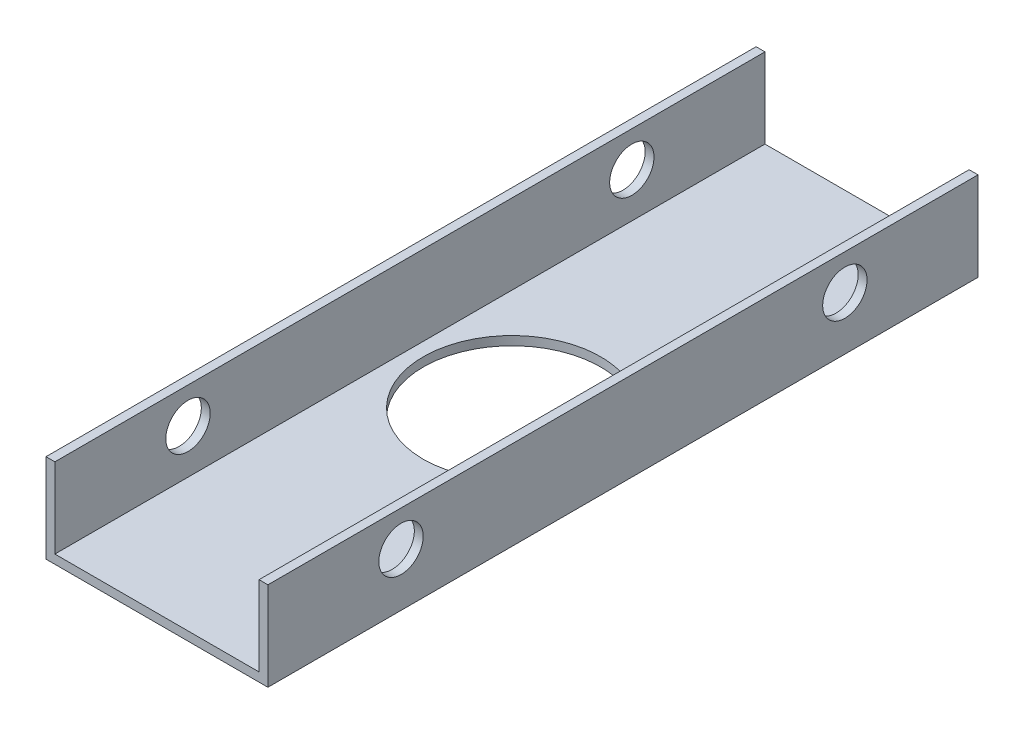
ISO-10303-21;
HEADER;
FILE_DESCRIPTION(('STEP AP214'),'2;1');
FILE_NAME('part.step','',(''),(''),'','','');
FILE_SCHEMA(('AUTOMOTIVE_DESIGN { 1 0 10303 214 1 1 1 1 }'));
ENDSEC;
DATA;
#1=APPLICATION_CONTEXT('core data for automotive mechanical design processes');
#2=APPLICATION_PROTOCOL_DEFINITION('international standard','automotive_design',2000,#1);
#3=PRODUCT_CONTEXT('',#1,'mechanical');
#4=PRODUCT('Part','Part','',(#3));
#5=PRODUCT_RELATED_PRODUCT_CATEGORY('part','',(#4));
#6=PRODUCT_DEFINITION_FORMATION('','',#4);
#7=PRODUCT_DEFINITION_CONTEXT('part definition',#1,'design');
#8=PRODUCT_DEFINITION('design','',#6,#7);
#9=PRODUCT_DEFINITION_SHAPE('','',#8);
#10=(LENGTH_UNIT() NAMED_UNIT(*) SI_UNIT(.MILLI.,.METRE.));
#11=(NAMED_UNIT(*) PLANE_ANGLE_UNIT() SI_UNIT($,.RADIAN.));
#12=(NAMED_UNIT(*) SI_UNIT($,.STERADIAN.) SOLID_ANGLE_UNIT());
#13=UNCERTAINTY_MEASURE_WITH_UNIT(LENGTH_MEASURE(1.E-05),#10,'distance_accuracy_value','');
#14=(GEOMETRIC_REPRESENTATION_CONTEXT(3) GLOBAL_UNCERTAINTY_ASSIGNED_CONTEXT((#13)) GLOBAL_UNIT_ASSIGNED_CONTEXT((#10,
#11,#12)) REPRESENTATION_CONTEXT('',''));
#15=CARTESIAN_POINT('',(0.,0.,0.));
#16=DIRECTION('',(0.,0.,1.));
#17=DIRECTION('',(1.,0.,0.));
#18=AXIS2_PLACEMENT_3D('',#15,#16,#17);
#19=CARTESIAN_POINT('',(0.,1.,0.));
#20=DIRECTION('',(0.,-1.,0.));
#21=DIRECTION('',(0.,0.,-1.));
#22=AXIS2_PLACEMENT_3D('',#19,#20,#21);
#23=PLANE('',#22);
#24=DIRECTION('',(0.,0.,-1.));
#25=VECTOR('',#24,1.);
#26=CARTESIAN_POINT('',(11.5,1.,40.));
#27=LINE('',#26,#25);
#28=CARTESIAN_POINT('',(11.5,0.999999999999999,40.));
#29=VERTEX_POINT('',#28);
#30=CARTESIAN_POINT('',(11.5,1.,-40.));
#31=VERTEX_POINT('',#30);
#32=EDGE_CURVE('E182',#29,#31,#27,.T.);
#33=ORIENTED_EDGE('',*,*,#32,.T.);
#34=DIRECTION('',(-1.,0.,0.));
#35=VECTOR('',#34,1.);
#36=CARTESIAN_POINT('',(-11.5,1.,-40.));
#37=LINE('',#36,#35);
#38=CARTESIAN_POINT('',(-11.5,1.,-40.));
#39=VERTEX_POINT('',#38);
#40=EDGE_CURVE('E185',#31,#39,#37,.T.);
#41=ORIENTED_EDGE('',*,*,#40,.T.);
#42=DIRECTION('',(0.,0.,1.));
#43=VECTOR('',#42,1.);
#44=CARTESIAN_POINT('',(-11.5,1.,40.));
#45=LINE('',#44,#43);
#46=CARTESIAN_POINT('',(-11.5,1.,40.));
#47=VERTEX_POINT('',#46);
#48=EDGE_CURVE('E48',#39,#47,#45,.T.);
#49=ORIENTED_EDGE('',*,*,#48,.T.);
#50=DIRECTION('',(1.,0.,0.));
#51=VECTOR('',#50,1.);
#52=CARTESIAN_POINT('',(-11.5,1.,40.));
#53=LINE('',#52,#51);
#54=EDGE_CURVE('E11',#47,#29,#53,.T.);
#55=ORIENTED_EDGE('',*,*,#54,.T.);
#56=EDGE_LOOP('',(#33,#41,#49,#55));
#57=FACE_BOUND('',#56,.T.);
#58=CARTESIAN_POINT('',(0.,1.,0.));
#59=DIRECTION('',(0.,1.,0.));
#60=DIRECTION('',(0.,0.,1.));
#61=AXIS2_PLACEMENT_3D('',#58,#59,#60);
#62=CIRCLE('',#61,10.);
#63=CARTESIAN_POINT('',(0.,1.,10.));
#64=VERTEX_POINT('',#63);
#65=EDGE_CURVE('E119',#64,#64,#62,.T.);
#66=ORIENTED_EDGE('',*,*,#65,.F.);
#67=EDGE_LOOP('',(#66));
#68=FACE_BOUND('',#67,.T.);
#69=ADVANCED_FACE('F39',(#57,#68),#23,.F.);
#70=CARTESIAN_POINT('',(0.,0.,0.));
#71=DIRECTION('',(0.,-1.,0.));
#72=DIRECTION('',(0.,0.,-1.));
#73=AXIS2_PLACEMENT_3D('',#70,#71,#72);
#74=PLANE('',#73);
#75=DIRECTION('',(-1.,0.,0.));
#76=VECTOR('',#75,1.);
#77=CARTESIAN_POINT('',(-11.5,0.,-40.));
#78=LINE('',#77,#76);
#79=CARTESIAN_POINT('',(12.5,0.,-40.));
#80=VERTEX_POINT('',#79);
#81=CARTESIAN_POINT('',(-12.5,0.,-40.));
#82=VERTEX_POINT('',#81);
#83=EDGE_CURVE('E107',#80,#82,#78,.T.);
#84=ORIENTED_EDGE('',*,*,#83,.F.);
#85=DIRECTION('',(0.,0.,1.));
#86=VECTOR('',#85,1.);
#87=CARTESIAN_POINT('',(12.5,0.,40.));
#88=LINE('',#87,#86);
#89=CARTESIAN_POINT('',(12.5,0.,40.));
#90=VERTEX_POINT('',#89);
#91=EDGE_CURVE('E111',#80,#90,#88,.T.);
#92=ORIENTED_EDGE('',*,*,#91,.T.);
#93=DIRECTION('',(1.,0.,0.));
#94=VECTOR('',#93,1.);
#95=CARTESIAN_POINT('',(-11.5,0.,40.));
#96=LINE('',#95,#94);
#97=CARTESIAN_POINT('',(-12.5,0.,40.));
#98=VERTEX_POINT('',#97);
#99=EDGE_CURVE('E43',#98,#90,#96,.T.);
#100=ORIENTED_EDGE('',*,*,#99,.F.);
#101=DIRECTION('',(0.,0.,1.));
#102=VECTOR('',#101,1.);
#103=CARTESIAN_POINT('',(-12.5,0.,40.));
#104=LINE('',#103,#102);
#105=EDGE_CURVE('E114',#82,#98,#104,.T.);
#106=ORIENTED_EDGE('',*,*,#105,.F.);
#107=EDGE_LOOP('',(#84,#92,#100,#106));
#108=FACE_BOUND('',#107,.T.);
#109=CARTESIAN_POINT('',(0.,0.,0.));
#110=DIRECTION('',(0.,1.,0.));
#111=DIRECTION('',(0.,0.,1.));
#112=AXIS2_PLACEMENT_3D('',#109,#110,#111);
#113=CIRCLE('',#112,10.);
#114=CARTESIAN_POINT('',(0.,0.,10.));
#115=VERTEX_POINT('',#114);
#116=EDGE_CURVE('E177',#115,#115,#113,.T.);
#117=ORIENTED_EDGE('',*,*,#116,.T.);
#118=EDGE_LOOP('',(#117));
#119=FACE_BOUND('',#118,.T.);
#120=ADVANCED_FACE('F109',(#108,#119),#74,.T.);
#121=CARTESIAN_POINT('',(-11.5,1.,-40.));
#122=DIRECTION('',(0.,0.,1.));
#123=DIRECTION('',(1.,0.,0.));
#124=AXIS2_PLACEMENT_3D('',#121,#122,#123);
#125=PLANE('',#124);
#126=ORIENTED_EDGE('',*,*,#83,.T.);
#127=DIRECTION('',(0.,-1.,0.));
#128=VECTOR('',#127,1.);
#129=CARTESIAN_POINT('',(-12.5,0.,-40.));
#130=LINE('',#129,#128);
#131=CARTESIAN_POINT('',(-12.5,10.,-40.));
#132=VERTEX_POINT('',#131);
#133=EDGE_CURVE('E164',#132,#82,#130,.T.);
#134=ORIENTED_EDGE('',*,*,#133,.F.);
#135=DIRECTION('',(1.,0.,0.));
#136=VECTOR('',#135,1.);
#137=CARTESIAN_POINT('',(-12.5,10.,-40.));
#138=LINE('',#137,#136);
#139=CARTESIAN_POINT('',(-11.5,10.,-40.));
#140=VERTEX_POINT('',#139);
#141=EDGE_CURVE('E166',#132,#140,#138,.T.);
#142=ORIENTED_EDGE('',*,*,#141,.T.);
#143=DIRECTION('',(0.,-1.,0.));
#144=VECTOR('',#143,1.);
#145=CARTESIAN_POINT('',(-11.5,0.,-40.));
#146=LINE('',#145,#144);
#147=EDGE_CURVE('E160',#140,#39,#146,.T.);
#148=ORIENTED_EDGE('',*,*,#147,.T.);
#149=ORIENTED_EDGE('',*,*,#40,.F.);
#150=DIRECTION('',(0.,-1.,0.));
#151=VECTOR('',#150,1.);
#152=CARTESIAN_POINT('',(11.5,0.,-40.));
#153=LINE('',#152,#151);
#154=CARTESIAN_POINT('',(11.5,10.,-40.));
#155=VERTEX_POINT('',#154);
#156=EDGE_CURVE('E64',#155,#31,#153,.T.);
#157=ORIENTED_EDGE('',*,*,#156,.F.);
#158=DIRECTION('',(-1.,0.,0.));
#159=VECTOR('',#158,1.);
#160=CARTESIAN_POINT('',(12.5,10.,-40.));
#161=LINE('',#160,#159);
#162=CARTESIAN_POINT('',(12.5,10.,-40.));
#163=VERTEX_POINT('',#162);
#164=EDGE_CURVE('E130',#163,#155,#161,.T.);
#165=ORIENTED_EDGE('',*,*,#164,.F.);
#166=DIRECTION('',(0.,-1.,0.));
#167=VECTOR('',#166,1.);
#168=CARTESIAN_POINT('',(12.5,0.,-40.));
#169=LINE('',#168,#167);
#170=EDGE_CURVE('E124',#163,#80,#169,.T.);
#171=ORIENTED_EDGE('',*,*,#170,.T.);
#172=EDGE_LOOP('',(#126,#134,#142,#148,#149,#157,#165,#171));
#173=FACE_BOUND('',#172,.T.);
#174=ADVANCED_FACE('F41',(#173),#125,.F.);
#175=CARTESIAN_POINT('',(-11.5,1.,40.));
#176=DIRECTION('',(0.,0.,-1.));
#177=DIRECTION('',(-1.,0.,0.));
#178=AXIS2_PLACEMENT_3D('',#175,#176,#177);
#179=PLANE('',#178);
#180=ORIENTED_EDGE('',*,*,#99,.T.);
#181=DIRECTION('',(0.,1.,0.));
#182=VECTOR('',#181,1.);
#183=CARTESIAN_POINT('',(12.5,10.,40.));
#184=LINE('',#183,#182);
#185=CARTESIAN_POINT('',(12.5,10.,40.));
#186=VERTEX_POINT('',#185);
#187=EDGE_CURVE('E127',#90,#186,#184,.T.);
#188=ORIENTED_EDGE('',*,*,#187,.T.);
#189=DIRECTION('',(-1.,0.,0.));
#190=VECTOR('',#189,1.);
#191=CARTESIAN_POINT('',(12.5,10.,40.));
#192=LINE('',#191,#190);
#193=CARTESIAN_POINT('',(11.5,10.,40.));
#194=VERTEX_POINT('',#193);
#195=EDGE_CURVE('E137',#186,#194,#192,.T.);
#196=ORIENTED_EDGE('',*,*,#195,.T.);
#197=DIRECTION('',(0.,1.,0.));
#198=VECTOR('',#197,1.);
#199=CARTESIAN_POINT('',(11.5,10.,40.));
#200=LINE('',#199,#198);
#201=EDGE_CURVE('E128',#29,#194,#200,.T.);
#202=ORIENTED_EDGE('',*,*,#201,.F.);
#203=ORIENTED_EDGE('',*,*,#54,.F.);
#204=DIRECTION('',(0.,1.,0.));
#205=VECTOR('',#204,1.);
#206=CARTESIAN_POINT('',(-11.5,10.,40.));
#207=LINE('',#206,#205);
#208=CARTESIAN_POINT('',(-11.5,10.,40.));
#209=VERTEX_POINT('',#208);
#210=EDGE_CURVE('E56',#47,#209,#207,.T.);
#211=ORIENTED_EDGE('',*,*,#210,.T.);
#212=DIRECTION('',(1.,0.,0.));
#213=VECTOR('',#212,1.);
#214=CARTESIAN_POINT('',(-12.5,10.,40.));
#215=LINE('',#214,#213);
#216=CARTESIAN_POINT('',(-12.5,10.,40.));
#217=VERTEX_POINT('',#216);
#218=EDGE_CURVE('E174',#217,#209,#215,.T.);
#219=ORIENTED_EDGE('',*,*,#218,.F.);
#220=DIRECTION('',(0.,1.,0.));
#221=VECTOR('',#220,1.);
#222=CARTESIAN_POINT('',(-12.5,10.,40.));
#223=LINE('',#222,#221);
#224=EDGE_CURVE('E159',#98,#217,#223,.T.);
#225=ORIENTED_EDGE('',*,*,#224,.F.);
#226=EDGE_LOOP('',(#180,#188,#196,#202,#203,#211,#219,#225));
#227=FACE_BOUND('',#226,.T.);
#228=ADVANCED_FACE('F194',(#227),#179,.F.);
#229=CARTESIAN_POINT('',(0.,1.,0.));
#230=DIRECTION('',(0.,-1.,0.));
#231=DIRECTION('',(0.,0.,-1.));
#232=AXIS2_PLACEMENT_3D('',#229,#230,#231);
#233=CYLINDRICAL_SURFACE('',#232,10.);
#234=ORIENTED_EDGE('',*,*,#65,.T.);
#235=EDGE_LOOP('',(#234));
#236=FACE_BOUND('',#235,.T.);
#237=ORIENTED_EDGE('',*,*,#116,.F.);
#238=EDGE_LOOP('',(#237));
#239=FACE_BOUND('',#238,.T.);
#240=ADVANCED_FACE('F224',(#236,#239),#233,.F.);
#241=CARTESIAN_POINT('',(-11.5,0.,0.));
#242=DIRECTION('',(1.,0.,0.));
#243=DIRECTION('',(0.,0.,-1.));
#244=AXIS2_PLACEMENT_3D('',#241,#242,#243);
#245=PLANE('',#244);
#246=CARTESIAN_POINT('',(-11.5,6.,25.));
#247=DIRECTION('',(-1.,0.,0.));
#248=DIRECTION('',(0.,0.,-1.));
#249=AXIS2_PLACEMENT_3D('',#246,#247,#248);
#250=CIRCLE('',#249,2.5);
#251=CARTESIAN_POINT('',(-11.5,6.,22.5));
#252=VERTEX_POINT('',#251);
#253=EDGE_CURVE('E146',#252,#252,#250,.T.);
#254=ORIENTED_EDGE('',*,*,#253,.T.);
#255=EDGE_LOOP('',(#254));
#256=FACE_BOUND('',#255,.T.);
#257=CARTESIAN_POINT('',(-11.5,6.,-25.));
#258=DIRECTION('',(-1.,0.,0.));
#259=DIRECTION('',(0.,0.,1.));
#260=AXIS2_PLACEMENT_3D('',#257,#258,#259);
#261=CIRCLE('',#260,2.5);
#262=CARTESIAN_POINT('',(-11.5,6.,-22.5));
#263=VERTEX_POINT('',#262);
#264=EDGE_CURVE('E150',#263,#263,#261,.T.);
#265=ORIENTED_EDGE('',*,*,#264,.T.);
#266=EDGE_LOOP('',(#265));
#267=FACE_BOUND('',#266,.T.);
#268=ORIENTED_EDGE('',*,*,#48,.F.);
#269=ORIENTED_EDGE('',*,*,#147,.F.);
#270=DIRECTION('',(0.,0.,-1.));
#271=VECTOR('',#270,1.);
#272=CARTESIAN_POINT('',(-11.5,10.,-40.));
#273=LINE('',#272,#271);
#274=EDGE_CURVE('E168',#209,#140,#273,.T.);
#275=ORIENTED_EDGE('',*,*,#274,.F.);
#276=ORIENTED_EDGE('',*,*,#210,.F.);
#277=EDGE_LOOP('',(#268,#269,#275,#276));
#278=FACE_BOUND('',#277,.T.);
#279=ADVANCED_FACE('F201',(#256,#267,#278),#245,.T.);
#280=CARTESIAN_POINT('',(-12.5,0.,0.));
#281=DIRECTION('',(1.,0.,0.));
#282=DIRECTION('',(0.,0.,-1.));
#283=AXIS2_PLACEMENT_3D('',#280,#281,#282);
#284=PLANE('',#283);
#285=ORIENTED_EDGE('',*,*,#105,.T.);
#286=ORIENTED_EDGE('',*,*,#224,.T.);
#287=DIRECTION('',(0.,0.,-1.));
#288=VECTOR('',#287,1.);
#289=CARTESIAN_POINT('',(-12.5,10.,-40.));
#290=LINE('',#289,#288);
#291=EDGE_CURVE('E162',#217,#132,#290,.T.);
#292=ORIENTED_EDGE('',*,*,#291,.T.);
#293=ORIENTED_EDGE('',*,*,#133,.T.);
#294=EDGE_LOOP('',(#285,#286,#292,#293));
#295=FACE_BOUND('',#294,.T.);
#296=CARTESIAN_POINT('',(-12.5,6.,-25.));
#297=DIRECTION('',(-1.,0.,0.));
#298=DIRECTION('',(0.,0.,1.));
#299=AXIS2_PLACEMENT_3D('',#296,#297,#298);
#300=CIRCLE('',#299,2.5);
#301=CARTESIAN_POINT('',(-12.5,6.,-22.5));
#302=VERTEX_POINT('',#301);
#303=EDGE_CURVE('E153',#302,#302,#300,.T.);
#304=ORIENTED_EDGE('',*,*,#303,.F.);
#305=EDGE_LOOP('',(#304));
#306=FACE_BOUND('',#305,.T.);
#307=CARTESIAN_POINT('',(-12.5,6.,25.));
#308=DIRECTION('',(-1.,0.,0.));
#309=DIRECTION('',(0.,0.,-1.));
#310=AXIS2_PLACEMENT_3D('',#307,#308,#309);
#311=CIRCLE('',#310,2.5);
#312=CARTESIAN_POINT('',(-12.5,6.,22.5));
#313=VERTEX_POINT('',#312);
#314=EDGE_CURVE('E147',#313,#313,#311,.T.);
#315=ORIENTED_EDGE('',*,*,#314,.F.);
#316=EDGE_LOOP('',(#315));
#317=FACE_BOUND('',#316,.T.);
#318=ADVANCED_FACE('F207',(#295,#306,#317),#284,.F.);
#319=CARTESIAN_POINT('',(-12.5,10.,-40.));
#320=DIRECTION('',(0.,-1.,0.));
#321=DIRECTION('',(0.,0.,-1.));
#322=AXIS2_PLACEMENT_3D('',#319,#320,#321);
#323=PLANE('',#322);
#324=ORIENTED_EDGE('',*,*,#274,.T.);
#325=ORIENTED_EDGE('',*,*,#141,.F.);
#326=ORIENTED_EDGE('',*,*,#291,.F.);
#327=ORIENTED_EDGE('',*,*,#218,.T.);
#328=EDGE_LOOP('',(#324,#325,#326,#327));
#329=FACE_BOUND('',#328,.T.);
#330=ADVANCED_FACE('F203',(#329),#323,.F.);
#331=CARTESIAN_POINT('',(-12.5,6.,-25.));
#332=DIRECTION('',(1.,0.,0.));
#333=DIRECTION('',(0.,0.,-1.));
#334=AXIS2_PLACEMENT_3D('',#331,#332,#333);
#335=CYLINDRICAL_SURFACE('',#334,2.5);
#336=ORIENTED_EDGE('',*,*,#303,.T.);
#337=EDGE_LOOP('',(#336));
#338=FACE_BOUND('',#337,.T.);
#339=ORIENTED_EDGE('',*,*,#264,.F.);
#340=EDGE_LOOP('',(#339));
#341=FACE_BOUND('',#340,.T.);
#342=ADVANCED_FACE('F218',(#338,#341),#335,.F.);
#343=CARTESIAN_POINT('',(-12.5,6.,25.));
#344=DIRECTION('',(1.,0.,0.));
#345=DIRECTION('',(0.,0.,-1.));
#346=AXIS2_PLACEMENT_3D('',#343,#344,#345);
#347=CYLINDRICAL_SURFACE('',#346,2.5);
#348=ORIENTED_EDGE('',*,*,#314,.T.);
#349=EDGE_LOOP('',(#348));
#350=FACE_BOUND('',#349,.T.);
#351=ORIENTED_EDGE('',*,*,#253,.F.);
#352=EDGE_LOOP('',(#351));
#353=FACE_BOUND('',#352,.T.);
#354=ADVANCED_FACE('F215',(#350,#353),#347,.F.);
#355=CARTESIAN_POINT('',(11.5,0.,0.));
#356=DIRECTION('',(-1.,0.,0.));
#357=DIRECTION('',(0.,0.,-1.));
#358=AXIS2_PLACEMENT_3D('',#355,#356,#357);
#359=PLANE('',#358);
#360=CARTESIAN_POINT('',(11.5,6.,-25.));
#361=DIRECTION('',(-1.,0.,0.));
#362=DIRECTION('',(0.,0.,1.));
#363=AXIS2_PLACEMENT_3D('',#360,#361,#362);
#364=CIRCLE('',#363,2.5);
#365=CARTESIAN_POINT('',(11.5,6.,-22.5));
#366=VERTEX_POINT('',#365);
#367=EDGE_CURVE('E375',#366,#366,#364,.T.);
#368=ORIENTED_EDGE('',*,*,#367,.F.);
#369=EDGE_LOOP('',(#368));
#370=FACE_BOUND('',#369,.T.);
#371=CARTESIAN_POINT('',(11.5,6.,25.));
#372=DIRECTION('',(-1.,0.,0.));
#373=DIRECTION('',(0.,0.,-1.));
#374=AXIS2_PLACEMENT_3D('',#371,#372,#373);
#375=CIRCLE('',#374,2.5);
#376=CARTESIAN_POINT('',(11.5,6.,22.5));
#377=VERTEX_POINT('',#376);
#378=EDGE_CURVE('E372',#377,#377,#375,.T.);
#379=ORIENTED_EDGE('',*,*,#378,.F.);
#380=EDGE_LOOP('',(#379));
#381=FACE_BOUND('',#380,.T.);
#382=ORIENTED_EDGE('',*,*,#32,.F.);
#383=ORIENTED_EDGE('',*,*,#201,.T.);
#384=DIRECTION('',(0.,0.,-1.));
#385=VECTOR('',#384,1.);
#386=CARTESIAN_POINT('',(11.5,10.,-40.));
#387=LINE('',#386,#385);
#388=EDGE_CURVE('E139',#194,#155,#387,.T.);
#389=ORIENTED_EDGE('',*,*,#388,.T.);
#390=ORIENTED_EDGE('',*,*,#156,.T.);
#391=EDGE_LOOP('',(#382,#383,#389,#390));
#392=FACE_BOUND('',#391,.T.);
#393=ADVANCED_FACE('F197',(#370,#381,#392),#359,.T.);
#394=CARTESIAN_POINT('',(12.5,10.,-40.));
#395=DIRECTION('',(0.,1.,0.));
#396=DIRECTION('',(0.,0.,1.));
#397=AXIS2_PLACEMENT_3D('',#394,#395,#396);
#398=PLANE('',#397);
#399=ORIENTED_EDGE('',*,*,#388,.F.);
#400=ORIENTED_EDGE('',*,*,#195,.F.);
#401=DIRECTION('',(0.,0.,-1.));
#402=VECTOR('',#401,1.);
#403=CARTESIAN_POINT('',(12.5,10.,-40.));
#404=LINE('',#403,#402);
#405=EDGE_CURVE('E131',#186,#163,#404,.T.);
#406=ORIENTED_EDGE('',*,*,#405,.T.);
#407=ORIENTED_EDGE('',*,*,#164,.T.);
#408=EDGE_LOOP('',(#399,#400,#406,#407));
#409=FACE_BOUND('',#408,.T.);
#410=ADVANCED_FACE('F199',(#409),#398,.T.);
#411=CARTESIAN_POINT('',(12.5,0.,0.));
#412=DIRECTION('',(-1.,0.,0.));
#413=DIRECTION('',(0.,0.,-1.));
#414=AXIS2_PLACEMENT_3D('',#411,#412,#413);
#415=PLANE('',#414);
#416=CARTESIAN_POINT('',(12.5,6.,25.));
#417=DIRECTION('',(-1.,0.,0.));
#418=DIRECTION('',(0.,0.,-1.));
#419=AXIS2_PLACEMENT_3D('',#416,#417,#418);
#420=CIRCLE('',#419,2.5);
#421=CARTESIAN_POINT('',(12.5,6.,22.5));
#422=VERTEX_POINT('',#421);
#423=EDGE_CURVE('E369',#422,#422,#420,.T.);
#424=ORIENTED_EDGE('',*,*,#423,.T.);
#425=EDGE_LOOP('',(#424));
#426=FACE_BOUND('',#425,.T.);
#427=CARTESIAN_POINT('',(12.5,6.,-25.));
#428=DIRECTION('',(-1.,0.,0.));
#429=DIRECTION('',(0.,0.,1.));
#430=AXIS2_PLACEMENT_3D('',#427,#428,#429);
#431=CIRCLE('',#430,2.5);
#432=CARTESIAN_POINT('',(12.5,6.,-22.5));
#433=VERTEX_POINT('',#432);
#434=EDGE_CURVE('E140',#433,#433,#431,.T.);
#435=ORIENTED_EDGE('',*,*,#434,.T.);
#436=EDGE_LOOP('',(#435));
#437=FACE_BOUND('',#436,.T.);
#438=ORIENTED_EDGE('',*,*,#91,.F.);
#439=ORIENTED_EDGE('',*,*,#170,.F.);
#440=ORIENTED_EDGE('',*,*,#405,.F.);
#441=ORIENTED_EDGE('',*,*,#187,.F.);
#442=EDGE_LOOP('',(#438,#439,#440,#441));
#443=FACE_BOUND('',#442,.T.);
#444=ADVANCED_FACE('F122',(#426,#437,#443),#415,.F.);
#445=CARTESIAN_POINT('',(12.5,6.,-25.));
#446=DIRECTION('',(-1.,0.,0.));
#447=DIRECTION('',(0.,0.,1.));
#448=AXIS2_PLACEMENT_3D('',#445,#446,#447);
#449=CYLINDRICAL_SURFACE('',#448,2.5);
#450=ORIENTED_EDGE('',*,*,#434,.F.);
#451=EDGE_LOOP('',(#450));
#452=FACE_BOUND('',#451,.T.);
#453=ORIENTED_EDGE('',*,*,#367,.T.);
#454=EDGE_LOOP('',(#453));
#455=FACE_BOUND('',#454,.T.);
#456=ADVANCED_FACE('F341',(#452,#455),#449,.F.);
#457=CARTESIAN_POINT('',(12.5,6.,25.));
#458=DIRECTION('',(-1.,0.,0.));
#459=DIRECTION('',(0.,0.,1.));
#460=AXIS2_PLACEMENT_3D('',#457,#458,#459);
#461=CYLINDRICAL_SURFACE('',#460,2.5);
#462=ORIENTED_EDGE('',*,*,#423,.F.);
#463=EDGE_LOOP('',(#462));
#464=FACE_BOUND('',#463,.T.);
#465=ORIENTED_EDGE('',*,*,#378,.T.);
#466=EDGE_LOOP('',(#465));
#467=FACE_BOUND('',#466,.T.);
#468=ADVANCED_FACE('F350',(#464,#467),#461,.F.);
#469=CLOSED_SHELL('',(#69,#120,#174,#228,#240,#279,#318,#330,#342,#354,#393,#410,#444,#456,#468));
#470=MANIFOLD_SOLID_BREP('B2',#469);
#471=ADVANCED_BREP_SHAPE_REPRESENTATION('',(#18,#470),#14);
#472=SHAPE_DEFINITION_REPRESENTATION(#9,#471);
ENDSEC;
END-ISO-10303-21;
